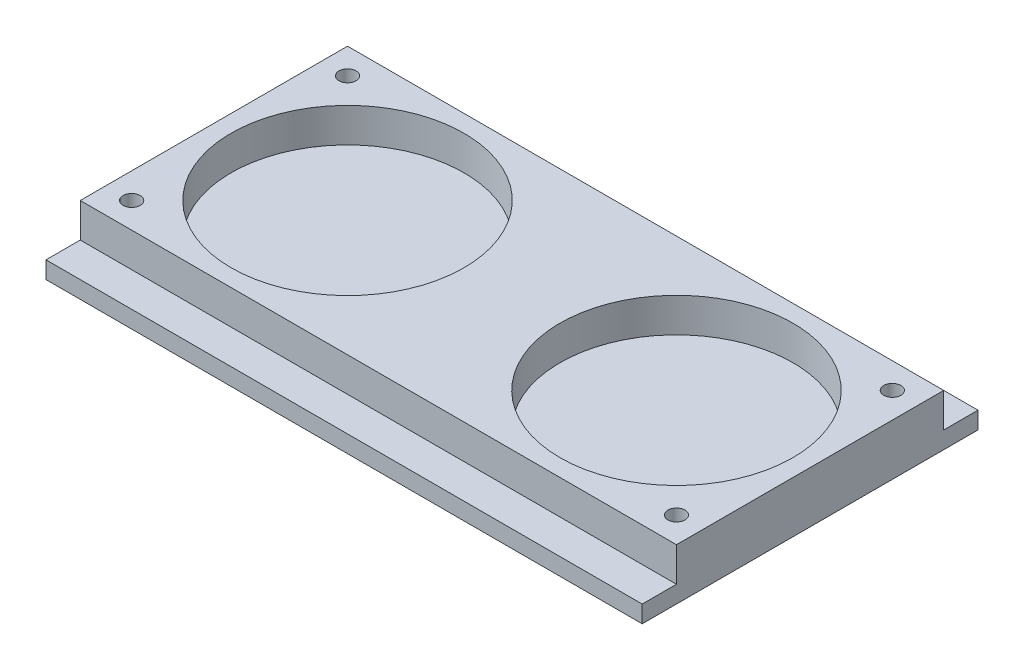
ISO-10303-21;
HEADER;
FILE_DESCRIPTION(('STEP AP214'),'2;1');
FILE_NAME('part.step','',(''),(''),'','','');
FILE_SCHEMA(('AUTOMOTIVE_DESIGN { 1 0 10303 214 1 1 1 1 }'));
ENDSEC;
DATA;
#1=APPLICATION_CONTEXT('core data for automotive mechanical design processes');
#2=APPLICATION_PROTOCOL_DEFINITION('international standard','automotive_design',2000,#1);
#3=PRODUCT_CONTEXT('',#1,'mechanical');
#4=PRODUCT('Part','Part','',(#3));
#5=PRODUCT_RELATED_PRODUCT_CATEGORY('part','',(#4));
#6=PRODUCT_DEFINITION_FORMATION('','',#4);
#7=PRODUCT_DEFINITION_CONTEXT('part definition',#1,'design');
#8=PRODUCT_DEFINITION('design','',#6,#7);
#9=PRODUCT_DEFINITION_SHAPE('','',#8);
#10=(LENGTH_UNIT() NAMED_UNIT(*) SI_UNIT(.MILLI.,.METRE.));
#11=(NAMED_UNIT(*) PLANE_ANGLE_UNIT() SI_UNIT($,.RADIAN.));
#12=(NAMED_UNIT(*) SI_UNIT($,.STERADIAN.) SOLID_ANGLE_UNIT());
#13=UNCERTAINTY_MEASURE_WITH_UNIT(LENGTH_MEASURE(1.E-05),#10,'distance_accuracy_value','');
#14=(GEOMETRIC_REPRESENTATION_CONTEXT(3) GLOBAL_UNCERTAINTY_ASSIGNED_CONTEXT((#13)) GLOBAL_UNIT_ASSIGNED_CONTEXT((#10,
#11,#12)) REPRESENTATION_CONTEXT('',''));
#15=CARTESIAN_POINT('',(0.,0.,0.));
#16=DIRECTION('',(0.,0.,1.));
#17=DIRECTION('',(1.,0.,0.));
#18=AXIS2_PLACEMENT_3D('',#15,#16,#17);
#19=CARTESIAN_POINT('',(0.,10.,39.));
#20=DIRECTION('',(0.,0.,-1.));
#21=DIRECTION('',(-1.,0.,0.));
#22=AXIS2_PLACEMENT_3D('',#19,#20,#21);
#23=PLANE('',#22);
#24=DIRECTION('',(1.,0.,0.));
#25=VECTOR('',#24,1.);
#26=CARTESIAN_POINT('',(0.,0.,39.));
#27=LINE('',#26,#25);
#28=CARTESIAN_POINT('',(-87.,0.,39.));
#29=VERTEX_POINT('',#28);
#30=CARTESIAN_POINT('',(87.,0.,39.));
#31=VERTEX_POINT('',#30);
#32=EDGE_CURVE('E185',#29,#31,#27,.T.);
#33=ORIENTED_EDGE('',*,*,#32,.T.);
#34=DIRECTION('',(0.,-1.,0.));
#35=VECTOR('',#34,1.);
#36=CARTESIAN_POINT('',(87.,10.,39.));
#37=LINE('',#36,#35);
#38=CARTESIAN_POINT('',(87.,10.,39.));
#39=VERTEX_POINT('',#38);
#40=EDGE_CURVE('E11',#39,#31,#37,.T.);
#41=ORIENTED_EDGE('',*,*,#40,.F.);
#42=DIRECTION('',(1.,0.,0.));
#43=VECTOR('',#42,1.);
#44=CARTESIAN_POINT('',(0.,10.,39.));
#45=LINE('',#44,#43);
#46=CARTESIAN_POINT('',(-87.,10.,39.));
#47=VERTEX_POINT('',#46);
#48=EDGE_CURVE('E172',#47,#39,#45,.T.);
#49=ORIENTED_EDGE('',*,*,#48,.F.);
#50=DIRECTION('',(0.,-1.,0.));
#51=VECTOR('',#50,1.);
#52=CARTESIAN_POINT('',(-87.,10.,39.));
#53=LINE('',#52,#51);
#54=EDGE_CURVE('E52',#47,#29,#53,.T.);
#55=ORIENTED_EDGE('',*,*,#54,.T.);
#56=EDGE_LOOP('',(#33,#41,#49,#55));
#57=FACE_BOUND('',#56,.T.);
#58=ADVANCED_FACE('F35',(#57),#23,.F.);
#59=CARTESIAN_POINT('',(87.,10.,0.));
#60=DIRECTION('',(-1.,0.,0.));
#61=DIRECTION('',(0.,0.,1.));
#62=AXIS2_PLACEMENT_3D('',#59,#60,#61);
#63=PLANE('',#62);
#64=ORIENTED_EDGE('',*,*,#40,.T.);
#65=DIRECTION('',(0.,0.,-1.));
#66=VECTOR('',#65,1.);
#67=CARTESIAN_POINT('',(87.,0.,0.));
#68=LINE('',#67,#66);
#69=CARTESIAN_POINT('',(87.,0.,49.));
#70=VERTEX_POINT('',#69);
#71=EDGE_CURVE('E140',#70,#31,#68,.T.);
#72=ORIENTED_EDGE('',*,*,#71,.F.);
#73=DIRECTION('',(0.,1.,0.));
#74=VECTOR('',#73,1.);
#75=CARTESIAN_POINT('',(87.,-5.,49.));
#76=LINE('',#75,#74);
#77=CARTESIAN_POINT('',(87.,-5.,49.));
#78=VERTEX_POINT('',#77);
#79=EDGE_CURVE('E113',#78,#70,#76,.T.);
#80=ORIENTED_EDGE('',*,*,#79,.F.);
#81=DIRECTION('',(0.,0.,-1.));
#82=VECTOR('',#81,1.);
#83=CARTESIAN_POINT('',(87.,-5.,0.));
#84=LINE('',#83,#82);
#85=CARTESIAN_POINT('',(87.,-5.,-49.));
#86=VERTEX_POINT('',#85);
#87=EDGE_CURVE('E129',#78,#86,#84,.T.);
#88=ORIENTED_EDGE('',*,*,#87,.T.);
#89=DIRECTION('',(0.,1.,0.));
#90=VECTOR('',#89,1.);
#91=CARTESIAN_POINT('',(87.,-5.,-49.));
#92=LINE('',#91,#90);
#93=CARTESIAN_POINT('',(87.,0.,-49.));
#94=VERTEX_POINT('',#93);
#95=EDGE_CURVE('E149',#86,#94,#92,.T.);
#96=ORIENTED_EDGE('',*,*,#95,.T.);
#97=CARTESIAN_POINT('',(87.,0.,-39.));
#98=VERTEX_POINT('',#97);
#99=EDGE_CURVE('E139',#98,#94,#68,.T.);
#100=ORIENTED_EDGE('',*,*,#99,.F.);
#101=DIRECTION('',(0.,-1.,0.));
#102=VECTOR('',#101,1.);
#103=CARTESIAN_POINT('',(87.,10.,-39.));
#104=LINE('',#103,#102);
#105=CARTESIAN_POINT('',(87.,10.,-39.));
#106=VERTEX_POINT('',#105);
#107=EDGE_CURVE('E44',#106,#98,#104,.T.);
#108=ORIENTED_EDGE('',*,*,#107,.F.);
#109=DIRECTION('',(0.,0.,-1.));
#110=VECTOR('',#109,1.);
#111=CARTESIAN_POINT('',(87.,10.,0.));
#112=LINE('',#111,#110);
#113=EDGE_CURVE('E75',#39,#106,#112,.T.);
#114=ORIENTED_EDGE('',*,*,#113,.F.);
#115=EDGE_LOOP('',(#64,#72,#80,#88,#96,#100,#108,#114));
#116=FACE_BOUND('',#115,.T.);
#117=ADVANCED_FACE('F197',(#116),#63,.F.);
#118=CARTESIAN_POINT('',(0.,10.,-39.));
#119=DIRECTION('',(0.,0.,-1.));
#120=DIRECTION('',(-1.,0.,0.));
#121=AXIS2_PLACEMENT_3D('',#118,#119,#120);
#122=PLANE('',#121);
#123=DIRECTION('',(1.,0.,0.));
#124=VECTOR('',#123,1.);
#125=CARTESIAN_POINT('',(0.,0.,-39.));
#126=LINE('',#125,#124);
#127=CARTESIAN_POINT('',(-87.,0.,-39.));
#128=VERTEX_POINT('',#127);
#129=EDGE_CURVE('E157',#128,#98,#126,.T.);
#130=ORIENTED_EDGE('',*,*,#129,.F.);
#131=DIRECTION('',(0.,-1.,0.));
#132=VECTOR('',#131,1.);
#133=CARTESIAN_POINT('',(-87.,10.,-39.));
#134=LINE('',#133,#132);
#135=CARTESIAN_POINT('',(-87.,10.,-39.));
#136=VERTEX_POINT('',#135);
#137=EDGE_CURVE('E64',#136,#128,#134,.T.);
#138=ORIENTED_EDGE('',*,*,#137,.F.);
#139=DIRECTION('',(1.,0.,0.));
#140=VECTOR('',#139,1.);
#141=CARTESIAN_POINT('',(0.,10.,-39.));
#142=LINE('',#141,#140);
#143=EDGE_CURVE('E175',#136,#106,#142,.T.);
#144=ORIENTED_EDGE('',*,*,#143,.T.);
#145=ORIENTED_EDGE('',*,*,#107,.T.);
#146=EDGE_LOOP('',(#130,#138,#144,#145));
#147=FACE_BOUND('',#146,.T.);
#148=ADVANCED_FACE('F191',(#147),#122,.T.);
#149=CARTESIAN_POINT('',(48.,10.,0.));
#150=DIRECTION('',(0.,-1.,0.));
#151=DIRECTION('',(0.,0.,-1.));
#152=AXIS2_PLACEMENT_3D('',#149,#150,#151);
#153=CYLINDRICAL_SURFACE('',#152,34.);
#154=CARTESIAN_POINT('',(48.,10.,0.));
#155=DIRECTION('',(0.,1.,0.));
#156=DIRECTION('',(0.,0.,1.));
#157=AXIS2_PLACEMENT_3D('',#154,#155,#156);
#158=CIRCLE('',#157,34.);
#159=CARTESIAN_POINT('',(48.,10.,34.));
#160=VERTEX_POINT('',#159);
#161=EDGE_CURVE('E169',#160,#160,#158,.T.);
#162=ORIENTED_EDGE('',*,*,#161,.T.);
#163=EDGE_LOOP('',(#162));
#164=FACE_BOUND('',#163,.T.);
#165=CARTESIAN_POINT('',(48.,0.,0.));
#166=DIRECTION('',(0.,1.,0.));
#167=DIRECTION('',(0.,0.,1.));
#168=AXIS2_PLACEMENT_3D('',#165,#166,#167);
#169=CIRCLE('',#168,34.);
#170=CARTESIAN_POINT('',(48.,0.,34.));
#171=VERTEX_POINT('',#170);
#172=EDGE_CURVE('E182',#171,#171,#169,.T.);
#173=ORIENTED_EDGE('',*,*,#172,.F.);
#174=EDGE_LOOP('',(#173));
#175=FACE_BOUND('',#174,.T.);
#176=ADVANCED_FACE('F221',(#164,#175),#153,.F.);
#177=CARTESIAN_POINT('',(-48.,10.,0.));
#178=DIRECTION('',(0.,-1.,0.));
#179=DIRECTION('',(0.,0.,-1.));
#180=AXIS2_PLACEMENT_3D('',#177,#178,#179);
#181=CYLINDRICAL_SURFACE('',#180,34.);
#182=CARTESIAN_POINT('',(-48.,10.,0.));
#183=DIRECTION('',(0.,1.,0.));
#184=DIRECTION('',(0.,0.,1.));
#185=AXIS2_PLACEMENT_3D('',#182,#183,#184);
#186=CIRCLE('',#185,34.);
#187=CARTESIAN_POINT('',(-48.,10.,34.));
#188=VERTEX_POINT('',#187);
#189=EDGE_CURVE('E166',#188,#188,#186,.T.);
#190=ORIENTED_EDGE('',*,*,#189,.T.);
#191=EDGE_LOOP('',(#190));
#192=FACE_BOUND('',#191,.T.);
#193=CARTESIAN_POINT('',(-48.,0.,0.));
#194=DIRECTION('',(0.,1.,0.));
#195=DIRECTION('',(0.,0.,1.));
#196=AXIS2_PLACEMENT_3D('',#193,#194,#195);
#197=CIRCLE('',#196,34.);
#198=CARTESIAN_POINT('',(-48.,0.,34.));
#199=VERTEX_POINT('',#198);
#200=EDGE_CURVE('E148',#199,#199,#197,.T.);
#201=ORIENTED_EDGE('',*,*,#200,.F.);
#202=EDGE_LOOP('',(#201));
#203=FACE_BOUND('',#202,.T.);
#204=ADVANCED_FACE('F224',(#192,#203),#181,.F.);
#205=CARTESIAN_POINT('',(-79.5,10.,-31.5));
#206=DIRECTION('',(0.,-1.,0.));
#207=DIRECTION('',(0.,0.,-1.));
#208=AXIS2_PLACEMENT_3D('',#205,#206,#207);
#209=CYLINDRICAL_SURFACE('',#208,2.5);
#210=CARTESIAN_POINT('',(-79.5,10.,-31.5));
#211=DIRECTION('',(0.,1.,0.));
#212=DIRECTION('',(0.,0.,1.));
#213=AXIS2_PLACEMENT_3D('',#210,#211,#212);
#214=CIRCLE('',#213,2.5);
#215=CARTESIAN_POINT('',(-79.5,10.,-29.));
#216=VERTEX_POINT('',#215);
#217=EDGE_CURVE('E163',#216,#216,#214,.T.);
#218=ORIENTED_EDGE('',*,*,#217,.T.);
#219=EDGE_LOOP('',(#218));
#220=FACE_BOUND('',#219,.T.);
#221=CARTESIAN_POINT('',(-79.5,-5.,-31.5));
#222=DIRECTION('',(0.,1.,0.));
#223=DIRECTION('',(0.,0.,1.));
#224=AXIS2_PLACEMENT_3D('',#221,#222,#223);
#225=CIRCLE('',#224,2.5);
#226=CARTESIAN_POINT('',(-79.5,-5.,-29.));
#227=VERTEX_POINT('',#226);
#228=EDGE_CURVE('E124',#227,#227,#225,.T.);
#229=ORIENTED_EDGE('',*,*,#228,.F.);
#230=EDGE_LOOP('',(#229));
#231=FACE_BOUND('',#230,.T.);
#232=ADVANCED_FACE('F228',(#220,#231),#209,.F.);
#233=CARTESIAN_POINT('',(-79.5,10.,31.5));
#234=DIRECTION('',(0.,-1.,0.));
#235=DIRECTION('',(0.,0.,-1.));
#236=AXIS2_PLACEMENT_3D('',#233,#234,#235);
#237=CYLINDRICAL_SURFACE('',#236,2.5);
#238=CARTESIAN_POINT('',(-79.5,10.,31.5));
#239=DIRECTION('',(0.,1.,0.));
#240=DIRECTION('',(0.,0.,1.));
#241=AXIS2_PLACEMENT_3D('',#238,#239,#240);
#242=CIRCLE('',#241,2.5);
#243=CARTESIAN_POINT('',(-79.5,10.,34.));
#244=VERTEX_POINT('',#243);
#245=EDGE_CURVE('E160',#244,#244,#242,.T.);
#246=ORIENTED_EDGE('',*,*,#245,.T.);
#247=EDGE_LOOP('',(#246));
#248=FACE_BOUND('',#247,.T.);
#249=CARTESIAN_POINT('',(-79.5,-5.,31.5));
#250=DIRECTION('',(0.,1.,0.));
#251=DIRECTION('',(0.,0.,1.));
#252=AXIS2_PLACEMENT_3D('',#249,#250,#251);
#253=CIRCLE('',#252,2.5);
#254=CARTESIAN_POINT('',(-79.5,-5.,34.));
#255=VERTEX_POINT('',#254);
#256=EDGE_CURVE('E249',#255,#255,#253,.T.);
#257=ORIENTED_EDGE('',*,*,#256,.F.);
#258=EDGE_LOOP('',(#257));
#259=FACE_BOUND('',#258,.T.);
#260=ADVANCED_FACE('F232',(#248,#259),#237,.F.);
#261=CARTESIAN_POINT('',(79.5,10.,31.5));
#262=DIRECTION('',(0.,-1.,0.));
#263=DIRECTION('',(0.,0.,-1.));
#264=AXIS2_PLACEMENT_3D('',#261,#262,#263);
#265=CYLINDRICAL_SURFACE('',#264,2.5);
#266=CARTESIAN_POINT('',(79.5,10.,31.5));
#267=DIRECTION('',(0.,1.,0.));
#268=DIRECTION('',(0.,0.,1.));
#269=AXIS2_PLACEMENT_3D('',#266,#267,#268);
#270=CIRCLE('',#269,2.5);
#271=CARTESIAN_POINT('',(79.5,10.,34.));
#272=VERTEX_POINT('',#271);
#273=EDGE_CURVE('E156',#272,#272,#270,.T.);
#274=ORIENTED_EDGE('',*,*,#273,.T.);
#275=EDGE_LOOP('',(#274));
#276=FACE_BOUND('',#275,.T.);
#277=CARTESIAN_POINT('',(79.5,-5.,31.5));
#278=DIRECTION('',(0.,1.,0.));
#279=DIRECTION('',(0.,0.,1.));
#280=AXIS2_PLACEMENT_3D('',#277,#278,#279);
#281=CIRCLE('',#280,2.5);
#282=CARTESIAN_POINT('',(79.5,-5.,34.));
#283=VERTEX_POINT('',#282);
#284=EDGE_CURVE('E247',#283,#283,#281,.T.);
#285=ORIENTED_EDGE('',*,*,#284,.F.);
#286=EDGE_LOOP('',(#285));
#287=FACE_BOUND('',#286,.T.);
#288=ADVANCED_FACE('F235',(#276,#287),#265,.F.);
#289=CARTESIAN_POINT('',(79.5,10.,-31.5));
#290=DIRECTION('',(0.,-1.,0.));
#291=DIRECTION('',(0.,0.,-1.));
#292=AXIS2_PLACEMENT_3D('',#289,#290,#291);
#293=CYLINDRICAL_SURFACE('',#292,2.5);
#294=CARTESIAN_POINT('',(79.5,10.,-31.5));
#295=DIRECTION('',(0.,1.,0.));
#296=DIRECTION('',(0.,0.,1.));
#297=AXIS2_PLACEMENT_3D('',#294,#295,#296);
#298=CIRCLE('',#297,2.5);
#299=CARTESIAN_POINT('',(79.5,10.,-29.));
#300=VERTEX_POINT('',#299);
#301=EDGE_CURVE('E153',#300,#300,#298,.T.);
#302=ORIENTED_EDGE('',*,*,#301,.T.);
#303=EDGE_LOOP('',(#302));
#304=FACE_BOUND('',#303,.T.);
#305=CARTESIAN_POINT('',(79.5,-5.,-31.5));
#306=DIRECTION('',(0.,1.,0.));
#307=DIRECTION('',(0.,0.,1.));
#308=AXIS2_PLACEMENT_3D('',#305,#306,#307);
#309=CIRCLE('',#308,2.5);
#310=CARTESIAN_POINT('',(79.5,-5.,-29.));
#311=VERTEX_POINT('',#310);
#312=EDGE_CURVE('E146',#311,#311,#309,.T.);
#313=ORIENTED_EDGE('',*,*,#312,.F.);
#314=EDGE_LOOP('',(#313));
#315=FACE_BOUND('',#314,.T.);
#316=ADVANCED_FACE('F37',(#304,#315),#293,.F.);
#317=CARTESIAN_POINT('',(-87.,10.,0.));
#318=DIRECTION('',(-1.,0.,0.));
#319=DIRECTION('',(0.,0.,1.));
#320=AXIS2_PLACEMENT_3D('',#317,#318,#319);
#321=PLANE('',#320);
#322=ORIENTED_EDGE('',*,*,#137,.T.);
#323=DIRECTION('',(0.,0.,-1.));
#324=VECTOR('',#323,1.);
#325=CARTESIAN_POINT('',(-87.,0.,0.));
#326=LINE('',#325,#324);
#327=CARTESIAN_POINT('',(-87.,0.,-49.));
#328=VERTEX_POINT('',#327);
#329=EDGE_CURVE('E137',#128,#328,#326,.T.);
#330=ORIENTED_EDGE('',*,*,#329,.T.);
#331=DIRECTION('',(0.,1.,0.));
#332=VECTOR('',#331,1.);
#333=CARTESIAN_POINT('',(-87.,-5.,-49.));
#334=LINE('',#333,#332);
#335=CARTESIAN_POINT('',(-87.,-5.,-49.));
#336=VERTEX_POINT('',#335);
#337=EDGE_CURVE('E120',#336,#328,#334,.T.);
#338=ORIENTED_EDGE('',*,*,#337,.F.);
#339=DIRECTION('',(0.,0.,-1.));
#340=VECTOR('',#339,1.);
#341=CARTESIAN_POINT('',(-87.,-5.,0.));
#342=LINE('',#341,#340);
#343=CARTESIAN_POINT('',(-87.,-5.,49.));
#344=VERTEX_POINT('',#343);
#345=EDGE_CURVE('E117',#344,#336,#342,.T.);
#346=ORIENTED_EDGE('',*,*,#345,.F.);
#347=DIRECTION('',(0.,1.,0.));
#348=VECTOR('',#347,1.);
#349=CARTESIAN_POINT('',(-87.,-5.,49.));
#350=LINE('',#349,#348);
#351=CARTESIAN_POINT('',(-87.,0.,49.));
#352=VERTEX_POINT('',#351);
#353=EDGE_CURVE('E105',#344,#352,#350,.T.);
#354=ORIENTED_EDGE('',*,*,#353,.T.);
#355=EDGE_CURVE('E135',#352,#29,#326,.T.);
#356=ORIENTED_EDGE('',*,*,#355,.T.);
#357=ORIENTED_EDGE('',*,*,#54,.F.);
#358=DIRECTION('',(0.,0.,-1.));
#359=VECTOR('',#358,1.);
#360=CARTESIAN_POINT('',(-87.,10.,0.));
#361=LINE('',#360,#359);
#362=EDGE_CURVE('E178',#47,#136,#361,.T.);
#363=ORIENTED_EDGE('',*,*,#362,.T.);
#364=EDGE_LOOP('',(#322,#330,#338,#346,#354,#356,#357,#363));
#365=FACE_BOUND('',#364,.T.);
#366=ADVANCED_FACE('F118',(#365),#321,.T.);
#367=CARTESIAN_POINT('',(0.,10.,0.));
#368=DIRECTION('',(0.,1.,0.));
#369=DIRECTION('',(0.,0.,1.));
#370=AXIS2_PLACEMENT_3D('',#367,#368,#369);
#371=PLANE('',#370);
#372=ORIENTED_EDGE('',*,*,#301,.F.);
#373=EDGE_LOOP('',(#372));
#374=FACE_BOUND('',#373,.T.);
#375=ORIENTED_EDGE('',*,*,#273,.F.);
#376=EDGE_LOOP('',(#375));
#377=FACE_BOUND('',#376,.T.);
#378=ORIENTED_EDGE('',*,*,#245,.F.);
#379=EDGE_LOOP('',(#378));
#380=FACE_BOUND('',#379,.T.);
#381=ORIENTED_EDGE('',*,*,#217,.F.);
#382=EDGE_LOOP('',(#381));
#383=FACE_BOUND('',#382,.T.);
#384=ORIENTED_EDGE('',*,*,#189,.F.);
#385=EDGE_LOOP('',(#384));
#386=FACE_BOUND('',#385,.T.);
#387=ORIENTED_EDGE('',*,*,#161,.F.);
#388=EDGE_LOOP('',(#387));
#389=FACE_BOUND('',#388,.T.);
#390=ORIENTED_EDGE('',*,*,#48,.T.);
#391=ORIENTED_EDGE('',*,*,#113,.T.);
#392=ORIENTED_EDGE('',*,*,#143,.F.);
#393=ORIENTED_EDGE('',*,*,#362,.F.);
#394=EDGE_LOOP('',(#390,#391,#392,#393));
#395=FACE_BOUND('',#394,.T.);
#396=ADVANCED_FACE('F265',(#374,#377,#380,#383,#386,#389,#395),#371,.T.);
#397=CARTESIAN_POINT('',(0.,0.,0.));
#398=DIRECTION('',(0.,1.,0.));
#399=DIRECTION('',(0.,0.,1.));
#400=AXIS2_PLACEMENT_3D('',#397,#398,#399);
#401=PLANE('',#400);
#402=ORIENTED_EDGE('',*,*,#329,.F.);
#403=ORIENTED_EDGE('',*,*,#129,.T.);
#404=ORIENTED_EDGE('',*,*,#99,.T.);
#405=DIRECTION('',(-1.,0.,0.));
#406=VECTOR('',#405,1.);
#407=CARTESIAN_POINT('',(0.,0.,-49.));
#408=LINE('',#407,#406);
#409=EDGE_CURVE('E143',#94,#328,#408,.T.);
#410=ORIENTED_EDGE('',*,*,#409,.T.);
#411=EDGE_LOOP('',(#402,#403,#404,#410));
#412=FACE_BOUND('',#411,.T.);
#413=ADVANCED_FACE('F196',(#412),#401,.T.);
#414=CARTESIAN_POINT('',(0.,-5.,0.));
#415=DIRECTION('',(0.,1.,0.));
#416=DIRECTION('',(0.,0.,1.));
#417=AXIS2_PLACEMENT_3D('',#414,#415,#416);
#418=PLANE('',#417);
#419=ORIENTED_EDGE('',*,*,#312,.T.);
#420=EDGE_LOOP('',(#419));
#421=FACE_BOUND('',#420,.T.);
#422=ORIENTED_EDGE('',*,*,#284,.T.);
#423=EDGE_LOOP('',(#422));
#424=FACE_BOUND('',#423,.T.);
#425=ORIENTED_EDGE('',*,*,#256,.T.);
#426=EDGE_LOOP('',(#425));
#427=FACE_BOUND('',#426,.T.);
#428=ORIENTED_EDGE('',*,*,#228,.T.);
#429=EDGE_LOOP('',(#428));
#430=FACE_BOUND('',#429,.T.);
#431=ORIENTED_EDGE('',*,*,#345,.T.);
#432=DIRECTION('',(-1.,0.,0.));
#433=VECTOR('',#432,1.);
#434=CARTESIAN_POINT('',(0.,-5.,-49.));
#435=LINE('',#434,#433);
#436=EDGE_CURVE('E114',#86,#336,#435,.T.);
#437=ORIENTED_EDGE('',*,*,#436,.F.);
#438=ORIENTED_EDGE('',*,*,#87,.F.);
#439=DIRECTION('',(1.,0.,0.));
#440=VECTOR('',#439,1.);
#441=CARTESIAN_POINT('',(0.,-5.,49.));
#442=LINE('',#441,#440);
#443=EDGE_CURVE('E109',#344,#78,#442,.T.);
#444=ORIENTED_EDGE('',*,*,#443,.F.);
#445=EDGE_LOOP('',(#431,#437,#438,#444));
#446=FACE_BOUND('',#445,.T.);
#447=ADVANCED_FACE('F127',(#421,#424,#427,#430,#446),#418,.F.);
#448=CARTESIAN_POINT('',(0.,-5.,49.));
#449=DIRECTION('',(0.,0.,1.));
#450=DIRECTION('',(1.,0.,0.));
#451=AXIS2_PLACEMENT_3D('',#448,#449,#450);
#452=PLANE('',#451);
#453=DIRECTION('',(1.,0.,0.));
#454=VECTOR('',#453,1.);
#455=CARTESIAN_POINT('',(0.,0.,49.));
#456=LINE('',#455,#454);
#457=EDGE_CURVE('E111',#352,#70,#456,.T.);
#458=ORIENTED_EDGE('',*,*,#457,.F.);
#459=ORIENTED_EDGE('',*,*,#353,.F.);
#460=ORIENTED_EDGE('',*,*,#443,.T.);
#461=ORIENTED_EDGE('',*,*,#79,.T.);
#462=EDGE_LOOP('',(#458,#459,#460,#461));
#463=FACE_BOUND('',#462,.T.);
#464=ADVANCED_FACE('F107',(#463),#452,.T.);
#465=CARTESIAN_POINT('',(0.,-5.,-49.));
#466=DIRECTION('',(0.,0.,-1.));
#467=DIRECTION('',(-1.,0.,0.));
#468=AXIS2_PLACEMENT_3D('',#465,#466,#467);
#469=PLANE('',#468);
#470=ORIENTED_EDGE('',*,*,#409,.F.);
#471=ORIENTED_EDGE('',*,*,#95,.F.);
#472=ORIENTED_EDGE('',*,*,#436,.T.);
#473=ORIENTED_EDGE('',*,*,#337,.T.);
#474=EDGE_LOOP('',(#470,#471,#472,#473));
#475=FACE_BOUND('',#474,.T.);
#476=ADVANCED_FACE('F200',(#475),#469,.T.);
#477=ORIENTED_EDGE('',*,*,#32,.F.);
#478=ORIENTED_EDGE('',*,*,#355,.F.);
#479=ORIENTED_EDGE('',*,*,#457,.T.);
#480=ORIENTED_EDGE('',*,*,#71,.T.);
#481=EDGE_LOOP('',(#477,#478,#479,#480));
#482=FACE_BOUND('',#481,.T.);
#483=ADVANCED_FACE('F202',(#482),#401,.T.);
#484=ORIENTED_EDGE('',*,*,#172,.T.);
#485=EDGE_LOOP('',(#484));
#486=FACE_BOUND('',#485,.T.);
#487=ADVANCED_FACE('F208',(#486),#401,.T.);
#488=ORIENTED_EDGE('',*,*,#200,.T.);
#489=EDGE_LOOP('',(#488));
#490=FACE_BOUND('',#489,.T.);
#491=ADVANCED_FACE('F211',(#490),#401,.T.);
#492=CLOSED_SHELL('',(#58,#117,#148,#176,#204,#232,#260,#288,#316,#366,#396,#413,#447,#464,#476,
#483,#487,#491));
#493=MANIFOLD_SOLID_BREP('B2',#492);
#494=ADVANCED_BREP_SHAPE_REPRESENTATION('',(#18,#493),#14);
#495=SHAPE_DEFINITION_REPRESENTATION(#9,#494);
ENDSEC;
END-ISO-10303-21;
